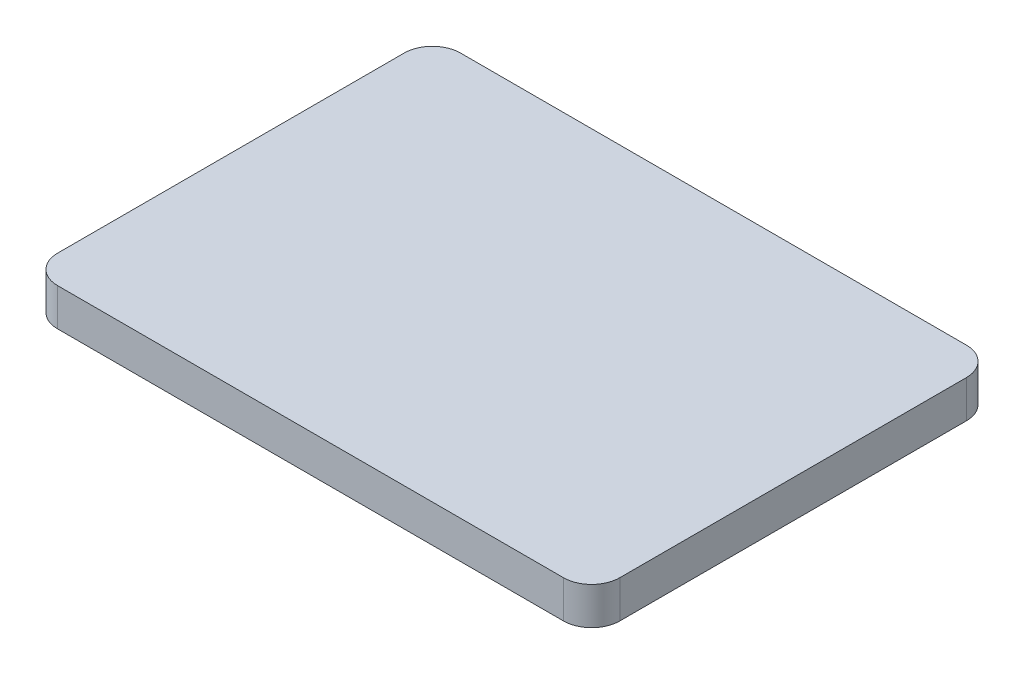
ISO-10303-21;
HEADER;
FILE_DESCRIPTION(('STEP AP214'),'2;1');
FILE_NAME('part.step','',(''),(''),'','','');
FILE_SCHEMA(('AUTOMOTIVE_DESIGN { 1 0 10303 214 1 1 1 1 }'));
ENDSEC;
DATA;
#1=APPLICATION_CONTEXT('core data for automotive mechanical design processes');
#2=APPLICATION_PROTOCOL_DEFINITION('international standard','automotive_design',2000,#1);
#3=PRODUCT_CONTEXT('',#1,'mechanical');
#4=PRODUCT('Part','Part','',(#3));
#5=PRODUCT_RELATED_PRODUCT_CATEGORY('part','',(#4));
#6=PRODUCT_DEFINITION_FORMATION('','',#4);
#7=PRODUCT_DEFINITION_CONTEXT('part definition',#1,'design');
#8=PRODUCT_DEFINITION('design','',#6,#7);
#9=PRODUCT_DEFINITION_SHAPE('','',#8);
#10=(LENGTH_UNIT() NAMED_UNIT(*) SI_UNIT(.MILLI.,.METRE.));
#11=(NAMED_UNIT(*) PLANE_ANGLE_UNIT() SI_UNIT($,.RADIAN.));
#12=(NAMED_UNIT(*) SI_UNIT($,.STERADIAN.) SOLID_ANGLE_UNIT());
#13=UNCERTAINTY_MEASURE_WITH_UNIT(LENGTH_MEASURE(1.E-05),#10,'distance_accuracy_value','');
#14=(GEOMETRIC_REPRESENTATION_CONTEXT(3) GLOBAL_UNCERTAINTY_ASSIGNED_CONTEXT((#13)) GLOBAL_UNIT_ASSIGNED_CONTEXT((#10,
#11,#12)) REPRESENTATION_CONTEXT('',''));
#15=CARTESIAN_POINT('',(0.,0.,0.));
#16=DIRECTION('',(0.,0.,1.));
#17=DIRECTION('',(1.,0.,0.));
#18=AXIS2_PLACEMENT_3D('',#15,#16,#17);
#19=CARTESIAN_POINT('',(0.,4.,-43.));
#20=DIRECTION('',(1.,0.,0.));
#21=DIRECTION('',(0.,0.,-1.));
#22=AXIS2_PLACEMENT_3D('',#19,#20,#21);
#23=PLANE('',#22);
#24=DIRECTION('',(0.,0.,1.));
#25=VECTOR('',#24,1.);
#26=CARTESIAN_POINT('',(0.,4.,-43.));
#27=LINE('',#26,#25);
#28=CARTESIAN_POINT('',(0.,4.,-40.));
#29=VERTEX_POINT('',#28);
#30=CARTESIAN_POINT('',(0.,4.,-3.));
#31=VERTEX_POINT('',#30);
#32=EDGE_CURVE('E118',#29,#31,#27,.T.);
#33=ORIENTED_EDGE('',*,*,#32,.F.);
#34=DIRECTION('',(0.,-1.,0.));
#35=VECTOR('',#34,1.);
#36=CARTESIAN_POINT('',(0.,4.,-40.));
#37=LINE('',#36,#35);
#38=CARTESIAN_POINT('',(0.,0.,-40.));
#39=VERTEX_POINT('',#38);
#40=EDGE_CURVE('E103',#29,#39,#37,.T.);
#41=ORIENTED_EDGE('',*,*,#40,.T.);
#42=DIRECTION('',(0.,0.,1.));
#43=VECTOR('',#42,1.);
#44=CARTESIAN_POINT('',(0.,0.,-43.));
#45=LINE('',#44,#43);
#46=CARTESIAN_POINT('',(0.,0.,-3.));
#47=VERTEX_POINT('',#46);
#48=EDGE_CURVE('E115',#39,#47,#45,.T.);
#49=ORIENTED_EDGE('',*,*,#48,.T.);
#50=DIRECTION('',(0.,-1.,0.));
#51=VECTOR('',#50,1.);
#52=CARTESIAN_POINT('',(0.,4.,-3.));
#53=LINE('',#52,#51);
#54=EDGE_CURVE('E120',#47,#31,#53,.F.);
#55=ORIENTED_EDGE('',*,*,#54,.T.);
#56=EDGE_LOOP('',(#33,#41,#49,#55));
#57=FACE_BOUND('',#56,.T.);
#58=ADVANCED_FACE('F33',(#57),#23,.F.);
#59=CARTESIAN_POINT('',(0.,4.,0.));
#60=DIRECTION('',(0.,0.,-1.));
#61=DIRECTION('',(-1.,0.,0.));
#62=AXIS2_PLACEMENT_3D('',#59,#60,#61);
#63=PLANE('',#62);
#64=DIRECTION('',(1.,0.,0.));
#65=VECTOR('',#64,1.);
#66=CARTESIAN_POINT('',(0.,0.,0.));
#67=LINE('',#66,#65);
#68=CARTESIAN_POINT('',(3.,0.,0.));
#69=VERTEX_POINT('',#68);
#70=CARTESIAN_POINT('',(57.,0.,0.));
#71=VERTEX_POINT('',#70);
#72=EDGE_CURVE('E124',#69,#71,#67,.T.);
#73=ORIENTED_EDGE('',*,*,#72,.T.);
#74=DIRECTION('',(0.,-1.,0.));
#75=VECTOR('',#74,1.);
#76=CARTESIAN_POINT('',(57.,4.,0.));
#77=LINE('',#76,#75);
#78=CARTESIAN_POINT('',(57.,4.,0.));
#79=VERTEX_POINT('',#78);
#80=EDGE_CURVE('E11',#71,#79,#77,.F.);
#81=ORIENTED_EDGE('',*,*,#80,.T.);
#82=DIRECTION('',(1.,0.,0.));
#83=VECTOR('',#82,1.);
#84=CARTESIAN_POINT('',(0.,4.,0.));
#85=LINE('',#84,#83);
#86=CARTESIAN_POINT('',(3.,4.,0.));
#87=VERTEX_POINT('',#86);
#88=EDGE_CURVE('E160',#87,#79,#85,.T.);
#89=ORIENTED_EDGE('',*,*,#88,.F.);
#90=DIRECTION('',(0.,-1.,0.));
#91=VECTOR('',#90,1.);
#92=CARTESIAN_POINT('',(3.,4.,0.));
#93=LINE('',#92,#91);
#94=EDGE_CURVE('E41',#87,#69,#93,.T.);
#95=ORIENTED_EDGE('',*,*,#94,.T.);
#96=EDGE_LOOP('',(#73,#81,#89,#95));
#97=FACE_BOUND('',#96,.T.);
#98=ADVANCED_FACE('F158',(#97),#63,.F.);
#99=CARTESIAN_POINT('',(60.,4.,0.));
#100=DIRECTION('',(-1.,0.,0.));
#101=DIRECTION('',(0.,0.,1.));
#102=AXIS2_PLACEMENT_3D('',#99,#100,#101);
#103=PLANE('',#102);
#104=DIRECTION('',(0.,0.,-1.));
#105=VECTOR('',#104,1.);
#106=CARTESIAN_POINT('',(60.,0.,0.));
#107=LINE('',#106,#105);
#108=CARTESIAN_POINT('',(60.,0.,-3.));
#109=VERTEX_POINT('',#108);
#110=CARTESIAN_POINT('',(60.,0.,-40.));
#111=VERTEX_POINT('',#110);
#112=EDGE_CURVE('E127',#109,#111,#107,.T.);
#113=ORIENTED_EDGE('',*,*,#112,.T.);
#114=DIRECTION('',(0.,-1.,0.));
#115=VECTOR('',#114,1.);
#116=CARTESIAN_POINT('',(60.,4.,-40.));
#117=LINE('',#116,#115);
#118=CARTESIAN_POINT('',(60.,4.,-40.));
#119=VERTEX_POINT('',#118);
#120=EDGE_CURVE('E48',#111,#119,#117,.F.);
#121=ORIENTED_EDGE('',*,*,#120,.T.);
#122=DIRECTION('',(0.,0.,-1.));
#123=VECTOR('',#122,1.);
#124=CARTESIAN_POINT('',(60.,4.,0.));
#125=LINE('',#124,#123);
#126=CARTESIAN_POINT('',(60.,4.,-3.));
#127=VERTEX_POINT('',#126);
#128=EDGE_CURVE('E168',#127,#119,#125,.T.);
#129=ORIENTED_EDGE('',*,*,#128,.F.);
#130=DIRECTION('',(0.,-1.,0.));
#131=VECTOR('',#130,1.);
#132=CARTESIAN_POINT('',(60.,4.,-3.));
#133=LINE('',#132,#131);
#134=EDGE_CURVE('E151',#127,#109,#133,.T.);
#135=ORIENTED_EDGE('',*,*,#134,.T.);
#136=EDGE_LOOP('',(#113,#121,#129,#135));
#137=FACE_BOUND('',#136,.T.);
#138=ADVANCED_FACE('F167',(#137),#103,.F.);
#139=CARTESIAN_POINT('',(60.,4.,-43.));
#140=DIRECTION('',(0.,0.,1.));
#141=DIRECTION('',(1.,0.,0.));
#142=AXIS2_PLACEMENT_3D('',#139,#140,#141);
#143=PLANE('',#142);
#144=DIRECTION('',(-1.,0.,0.));
#145=VECTOR('',#144,1.);
#146=CARTESIAN_POINT('',(60.,0.,-43.));
#147=LINE('',#146,#145);
#148=CARTESIAN_POINT('',(57.,0.,-43.));
#149=VERTEX_POINT('',#148);
#150=CARTESIAN_POINT('',(3.,0.,-43.));
#151=VERTEX_POINT('',#150);
#152=EDGE_CURVE('E134',#149,#151,#147,.T.);
#153=ORIENTED_EDGE('',*,*,#152,.T.);
#154=DIRECTION('',(0.,-1.,0.));
#155=VECTOR('',#154,1.);
#156=CARTESIAN_POINT('',(3.,4.,-43.));
#157=LINE('',#156,#155);
#158=CARTESIAN_POINT('',(3.,4.,-43.));
#159=VERTEX_POINT('',#158);
#160=EDGE_CURVE('E104',#151,#159,#157,.F.);
#161=ORIENTED_EDGE('',*,*,#160,.T.);
#162=DIRECTION('',(-1.,0.,0.));
#163=VECTOR('',#162,1.);
#164=CARTESIAN_POINT('',(60.,4.,-43.));
#165=LINE('',#164,#163);
#166=CARTESIAN_POINT('',(57.,4.,-43.));
#167=VERTEX_POINT('',#166);
#168=EDGE_CURVE('E130',#167,#159,#165,.T.);
#169=ORIENTED_EDGE('',*,*,#168,.F.);
#170=DIRECTION('',(0.,-1.,0.));
#171=VECTOR('',#170,1.);
#172=CARTESIAN_POINT('',(57.,4.,-43.));
#173=LINE('',#172,#171);
#174=EDGE_CURVE('E109',#167,#149,#173,.T.);
#175=ORIENTED_EDGE('',*,*,#174,.T.);
#176=EDGE_LOOP('',(#153,#161,#169,#175));
#177=FACE_BOUND('',#176,.T.);
#178=ADVANCED_FACE('F196',(#177),#143,.F.);
#179=CARTESIAN_POINT('',(0.,4.,0.));
#180=DIRECTION('',(0.,1.,0.));
#181=DIRECTION('',(0.,0.,1.));
#182=AXIS2_PLACEMENT_3D('',#179,#180,#181);
#183=PLANE('',#182);
#184=ORIENTED_EDGE('',*,*,#168,.T.);
#185=CARTESIAN_POINT('',(3.,4.,-40.));
#186=DIRECTION('',(0.,1.,0.));
#187=DIRECTION('',(0.,0.,1.));
#188=AXIS2_PLACEMENT_3D('',#185,#186,#187);
#189=CIRCLE('',#188,3.);
#190=EDGE_CURVE('E149',#159,#29,#189,.T.);
#191=ORIENTED_EDGE('',*,*,#190,.T.);
#192=ORIENTED_EDGE('',*,*,#32,.T.);
#193=CARTESIAN_POINT('',(3.,4.,-3.));
#194=DIRECTION('',(0.,1.,0.));
#195=DIRECTION('',(0.,0.,1.));
#196=AXIS2_PLACEMENT_3D('',#193,#194,#195);
#197=CIRCLE('',#196,3.);
#198=EDGE_CURVE('E144',#31,#87,#197,.T.);
#199=ORIENTED_EDGE('',*,*,#198,.T.);
#200=ORIENTED_EDGE('',*,*,#88,.T.);
#201=CARTESIAN_POINT('',(57.,4.,-3.));
#202=DIRECTION('',(0.,1.,0.));
#203=DIRECTION('',(0.,0.,1.));
#204=AXIS2_PLACEMENT_3D('',#201,#202,#203);
#205=CIRCLE('',#204,3.);
#206=EDGE_CURVE('E55',#79,#127,#205,.T.);
#207=ORIENTED_EDGE('',*,*,#206,.T.);
#208=ORIENTED_EDGE('',*,*,#128,.T.);
#209=CARTESIAN_POINT('',(57.,4.,-40.));
#210=DIRECTION('',(0.,1.,0.));
#211=DIRECTION('',(0.,0.,1.));
#212=AXIS2_PLACEMENT_3D('',#209,#210,#211);
#213=CIRCLE('',#212,3.);
#214=EDGE_CURVE('E147',#119,#167,#213,.T.);
#215=ORIENTED_EDGE('',*,*,#214,.T.);
#216=EDGE_LOOP('',(#184,#191,#192,#199,#200,#207,#208,#215));
#217=FACE_BOUND('',#216,.T.);
#218=ADVANCED_FACE('F173',(#217),#183,.T.);
#219=CARTESIAN_POINT('',(0.,0.,0.));
#220=DIRECTION('',(0.,1.,0.));
#221=DIRECTION('',(0.,0.,1.));
#222=AXIS2_PLACEMENT_3D('',#219,#220,#221);
#223=PLANE('',#222);
#224=ORIENTED_EDGE('',*,*,#48,.F.);
#225=CARTESIAN_POINT('',(3.,0.,-40.));
#226=DIRECTION('',(0.,1.,0.));
#227=DIRECTION('',(0.,0.,1.));
#228=AXIS2_PLACEMENT_3D('',#225,#226,#227);
#229=CIRCLE('',#228,3.);
#230=EDGE_CURVE('E99',#39,#151,#229,.F.);
#231=ORIENTED_EDGE('',*,*,#230,.T.);
#232=ORIENTED_EDGE('',*,*,#152,.F.);
#233=CARTESIAN_POINT('',(57.,0.,-40.));
#234=DIRECTION('',(0.,1.,0.));
#235=DIRECTION('',(0.,0.,1.));
#236=AXIS2_PLACEMENT_3D('',#233,#234,#235);
#237=CIRCLE('',#236,3.);
#238=EDGE_CURVE('E110',#149,#111,#237,.F.);
#239=ORIENTED_EDGE('',*,*,#238,.T.);
#240=ORIENTED_EDGE('',*,*,#112,.F.);
#241=CARTESIAN_POINT('',(57.,0.,-3.));
#242=DIRECTION('',(0.,1.,0.));
#243=DIRECTION('',(0.,0.,1.));
#244=AXIS2_PLACEMENT_3D('',#241,#242,#243);
#245=CIRCLE('',#244,3.);
#246=EDGE_CURVE('E138',#109,#71,#245,.F.);
#247=ORIENTED_EDGE('',*,*,#246,.T.);
#248=ORIENTED_EDGE('',*,*,#72,.F.);
#249=CARTESIAN_POINT('',(3.,0.,-3.));
#250=DIRECTION('',(0.,1.,0.));
#251=DIRECTION('',(0.,0.,1.));
#252=AXIS2_PLACEMENT_3D('',#249,#250,#251);
#253=CIRCLE('',#252,3.);
#254=EDGE_CURVE('E119',#69,#47,#253,.F.);
#255=ORIENTED_EDGE('',*,*,#254,.T.);
#256=EDGE_LOOP('',(#224,#231,#232,#239,#240,#247,#248,#255));
#257=FACE_BOUND('',#256,.T.);
#258=ADVANCED_FACE('F122',(#257),#223,.F.);
#259=CARTESIAN_POINT('',(3.,4.,-40.));
#260=DIRECTION('',(0.,-1.,0.));
#261=DIRECTION('',(0.,0.,-1.));
#262=AXIS2_PLACEMENT_3D('',#259,#260,#261);
#263=CYLINDRICAL_SURFACE('',#262,3.);
#264=ORIENTED_EDGE('',*,*,#190,.F.);
#265=ORIENTED_EDGE('',*,*,#160,.F.);
#266=ORIENTED_EDGE('',*,*,#230,.F.);
#267=ORIENTED_EDGE('',*,*,#40,.F.);
#268=EDGE_LOOP('',(#264,#265,#266,#267));
#269=FACE_BOUND('',#268,.T.);
#270=ADVANCED_FACE('F102',(#269),#263,.T.);
#271=CARTESIAN_POINT('',(57.,4.,-40.));
#272=DIRECTION('',(0.,-1.,0.));
#273=DIRECTION('',(0.,0.,-1.));
#274=AXIS2_PLACEMENT_3D('',#271,#272,#273);
#275=CYLINDRICAL_SURFACE('',#274,3.);
#276=ORIENTED_EDGE('',*,*,#214,.F.);
#277=ORIENTED_EDGE('',*,*,#120,.F.);
#278=ORIENTED_EDGE('',*,*,#238,.F.);
#279=ORIENTED_EDGE('',*,*,#174,.F.);
#280=EDGE_LOOP('',(#276,#277,#278,#279));
#281=FACE_BOUND('',#280,.T.);
#282=ADVANCED_FACE('F178',(#281),#275,.T.);
#283=CARTESIAN_POINT('',(57.,4.,-3.));
#284=DIRECTION('',(0.,-1.,0.));
#285=DIRECTION('',(0.,0.,-1.));
#286=AXIS2_PLACEMENT_3D('',#283,#284,#285);
#287=CYLINDRICAL_SURFACE('',#286,3.);
#288=ORIENTED_EDGE('',*,*,#206,.F.);
#289=ORIENTED_EDGE('',*,*,#80,.F.);
#290=ORIENTED_EDGE('',*,*,#246,.F.);
#291=ORIENTED_EDGE('',*,*,#134,.F.);
#292=EDGE_LOOP('',(#288,#289,#290,#291));
#293=FACE_BOUND('',#292,.T.);
#294=ADVANCED_FACE('F166',(#293),#287,.T.);
#295=CARTESIAN_POINT('',(3.,4.,-3.));
#296=DIRECTION('',(0.,-1.,0.));
#297=DIRECTION('',(0.,0.,-1.));
#298=AXIS2_PLACEMENT_3D('',#295,#296,#297);
#299=CYLINDRICAL_SURFACE('',#298,3.);
#300=ORIENTED_EDGE('',*,*,#198,.F.);
#301=ORIENTED_EDGE('',*,*,#54,.F.);
#302=ORIENTED_EDGE('',*,*,#254,.F.);
#303=ORIENTED_EDGE('',*,*,#94,.F.);
#304=EDGE_LOOP('',(#300,#301,#302,#303));
#305=FACE_BOUND('',#304,.T.);
#306=ADVANCED_FACE('F35',(#305),#299,.T.);
#307=CLOSED_SHELL('',(#58,#98,#138,#178,#218,#258,#270,#282,#294,#306));
#308=MANIFOLD_SOLID_BREP('B2',#307);
#309=ADVANCED_BREP_SHAPE_REPRESENTATION('',(#18,#308),#14);
#310=SHAPE_DEFINITION_REPRESENTATION(#9,#309);
ENDSEC;
END-ISO-10303-21;
